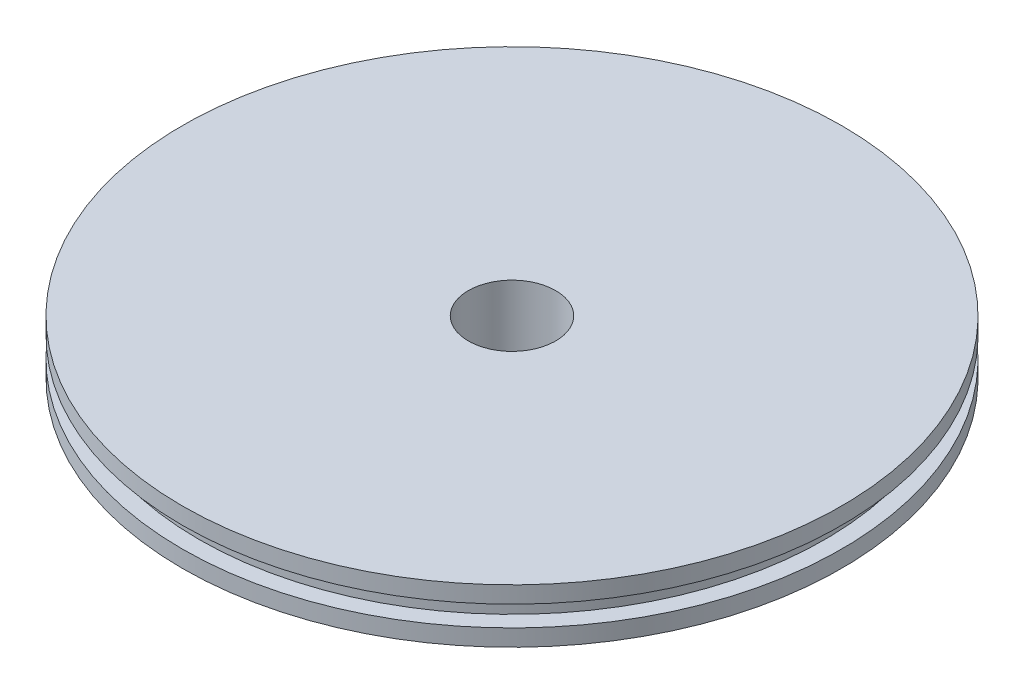
ISO-10303-21;
HEADER;
FILE_DESCRIPTION(('STEP AP214'),'2;1');
FILE_NAME('part.step','',(''),(''),'','','');
FILE_SCHEMA(('AUTOMOTIVE_DESIGN { 1 0 10303 214 1 1 1 1 }'));
ENDSEC;
DATA;
#1=APPLICATION_CONTEXT('core data for automotive mechanical design processes');
#2=APPLICATION_PROTOCOL_DEFINITION('international standard','automotive_design',2000,#1);
#3=PRODUCT_CONTEXT('',#1,'mechanical');
#4=PRODUCT('Part','Part','',(#3));
#5=PRODUCT_RELATED_PRODUCT_CATEGORY('part','',(#4));
#6=PRODUCT_DEFINITION_FORMATION('','',#4);
#7=PRODUCT_DEFINITION_CONTEXT('part definition',#1,'design');
#8=PRODUCT_DEFINITION('design','',#6,#7);
#9=PRODUCT_DEFINITION_SHAPE('','',#8);
#10=(LENGTH_UNIT() NAMED_UNIT(*) SI_UNIT(.MILLI.,.METRE.));
#11=(NAMED_UNIT(*) PLANE_ANGLE_UNIT() SI_UNIT($,.RADIAN.));
#12=(NAMED_UNIT(*) SI_UNIT($,.STERADIAN.) SOLID_ANGLE_UNIT());
#13=UNCERTAINTY_MEASURE_WITH_UNIT(LENGTH_MEASURE(1.E-05),#10,'distance_accuracy_value','');
#14=(GEOMETRIC_REPRESENTATION_CONTEXT(3) GLOBAL_UNCERTAINTY_ASSIGNED_CONTEXT((#13)) GLOBAL_UNIT_ASSIGNED_CONTEXT((#10,
#11,#12)) REPRESENTATION_CONTEXT('',''));
#15=CARTESIAN_POINT('',(0.,0.,0.));
#16=DIRECTION('',(0.,0.,1.));
#17=DIRECTION('',(1.,0.,0.));
#18=AXIS2_PLACEMENT_3D('',#15,#16,#17);
#19=CARTESIAN_POINT('',(0.,0.,30.9499));
#20=DIRECTION('',(0.,1.,0.));
#21=DIRECTION('',(0.,0.,1.));
#22=AXIS2_PLACEMENT_3D('',#19,#20,#21);
#23=PLANE('',#22);
#24=CARTESIAN_POINT('',(0.,0.,0.));
#25=DIRECTION('',(0.,-1.,0.));
#26=DIRECTION('',(0.,0.,-1.));
#27=AXIS2_PLACEMENT_3D('',#24,#25,#26);
#28=CIRCLE('',#27,4.1021);
#29=CARTESIAN_POINT('',(0.,0.,-4.1021));
#30=VERTEX_POINT('',#29);
#31=EDGE_CURVE('E57',#30,#30,#28,.T.);
#32=ORIENTED_EDGE('',*,*,#31,.T.);
#33=EDGE_LOOP('',(#32));
#34=FACE_BOUND('',#33,.T.);
#35=CARTESIAN_POINT('',(0.,0.,0.));
#36=DIRECTION('',(0.,1.,0.));
#37=DIRECTION('',(0.,0.,1.));
#38=AXIS2_PLACEMENT_3D('',#35,#36,#37);
#39=CIRCLE('',#38,30.9499);
#40=CARTESIAN_POINT('',(0.,0.,30.9499));
#41=VERTEX_POINT('',#40);
#42=EDGE_CURVE('E60',#41,#41,#39,.T.);
#43=ORIENTED_EDGE('',*,*,#42,.T.);
#44=EDGE_LOOP('',(#43));
#45=FACE_BOUND('',#44,.T.);
#46=ADVANCED_FACE('F41',(#34,#45),#23,.T.);
#47=CARTESIAN_POINT('',(0.,-5.08,0.));
#48=DIRECTION('',(0.,-1.,0.));
#49=DIRECTION('',(0.,0.,-1.));
#50=AXIS2_PLACEMENT_3D('',#47,#48,#49);
#51=PLANE('',#50);
#52=CARTESIAN_POINT('',(0.,-5.08,0.));
#53=DIRECTION('',(0.,-1.,0.));
#54=DIRECTION('',(0.,0.,-1.));
#55=AXIS2_PLACEMENT_3D('',#52,#53,#54);
#56=CIRCLE('',#55,22.86);
#57=CARTESIAN_POINT('',(0.,-5.08,-22.86));
#58=VERTEX_POINT('',#57);
#59=EDGE_CURVE('E10',#58,#58,#56,.T.);
#60=ORIENTED_EDGE('',*,*,#59,.F.);
#61=EDGE_LOOP('',(#60));
#62=FACE_BOUND('',#61,.T.);
#63=CARTESIAN_POINT('',(0.,-5.08,0.));
#64=DIRECTION('',(0.,1.,0.));
#65=DIRECTION('',(0.,0.,1.));
#66=AXIS2_PLACEMENT_3D('',#63,#64,#65);
#67=CIRCLE('',#66,30.9499);
#68=CARTESIAN_POINT('',(0.,-5.08,30.9499));
#69=VERTEX_POINT('',#68);
#70=EDGE_CURVE('E44',#69,#69,#67,.T.);
#71=ORIENTED_EDGE('',*,*,#70,.F.);
#72=EDGE_LOOP('',(#71));
#73=FACE_BOUND('',#72,.T.);
#74=ADVANCED_FACE('F79',(#62,#73),#51,.T.);
#75=CARTESIAN_POINT('',(0.,0.,0.));
#76=DIRECTION('',(0.,1.,0.));
#77=DIRECTION('',(0.,0.,1.));
#78=AXIS2_PLACEMENT_3D('',#75,#76,#77);
#79=CYLINDRICAL_SURFACE('',#78,30.9499);
#80=ORIENTED_EDGE('',*,*,#70,.T.);
#81=EDGE_LOOP('',(#80));
#82=FACE_BOUND('',#81,.T.);
#83=CARTESIAN_POINT('',(0.,-3.5052,0.));
#84=DIRECTION('',(0.,1.,0.));
#85=DIRECTION('',(0.,0.,1.));
#86=AXIS2_PLACEMENT_3D('',#83,#84,#85);
#87=CIRCLE('',#86,30.9499);
#88=CARTESIAN_POINT('',(0.,-3.5052,30.9499));
#89=VERTEX_POINT('',#88);
#90=EDGE_CURVE('E52',#89,#89,#87,.T.);
#91=ORIENTED_EDGE('',*,*,#90,.F.);
#92=EDGE_LOOP('',(#91));
#93=FACE_BOUND('',#92,.T.);
#94=ADVANCED_FACE('F77',(#82,#93),#79,.T.);
#95=CARTESIAN_POINT('',(0.,-3.5052,30.9499));
#96=DIRECTION('',(0.,1.,0.));
#97=DIRECTION('',(0.,0.,1.));
#98=AXIS2_PLACEMENT_3D('',#95,#96,#97);
#99=PLANE('',#98);
#100=ORIENTED_EDGE('',*,*,#90,.T.);
#101=EDGE_LOOP('',(#100));
#102=FACE_BOUND('',#101,.T.);
#103=CARTESIAN_POINT('',(0.,-3.5052,0.));
#104=DIRECTION('',(0.,1.,0.));
#105=DIRECTION('',(0.,0.,1.));
#106=AXIS2_PLACEMENT_3D('',#103,#104,#105);
#107=CIRCLE('',#106,29.3878);
#108=CARTESIAN_POINT('',(0.,-3.5052,29.3878));
#109=VERTEX_POINT('',#108);
#110=EDGE_CURVE('E69',#109,#109,#107,.T.);
#111=ORIENTED_EDGE('',*,*,#110,.F.);
#112=EDGE_LOOP('',(#111));
#113=FACE_BOUND('',#112,.T.);
#114=ADVANCED_FACE('F74',(#102,#113),#99,.T.);
#115=CARTESIAN_POINT('',(0.,0.,0.));
#116=DIRECTION('',(0.,1.,0.));
#117=DIRECTION('',(0.,0.,1.));
#118=AXIS2_PLACEMENT_3D('',#115,#116,#117);
#119=CYLINDRICAL_SURFACE('',#118,29.3878);
#120=ORIENTED_EDGE('',*,*,#110,.T.);
#121=EDGE_LOOP('',(#120));
#122=FACE_BOUND('',#121,.T.);
#123=CARTESIAN_POINT('',(0.,-1.5748,0.));
#124=DIRECTION('',(0.,1.,0.));
#125=DIRECTION('',(0.,0.,1.));
#126=AXIS2_PLACEMENT_3D('',#123,#124,#125);
#127=CIRCLE('',#126,29.3878);
#128=CARTESIAN_POINT('',(0.,-1.5748,29.3878));
#129=VERTEX_POINT('',#128);
#130=EDGE_CURVE('E66',#129,#129,#127,.T.);
#131=ORIENTED_EDGE('',*,*,#130,.F.);
#132=EDGE_LOOP('',(#131));
#133=FACE_BOUND('',#132,.T.);
#134=ADVANCED_FACE('F85',(#122,#133),#119,.T.);
#135=CARTESIAN_POINT('',(0.,-1.5748,29.3878));
#136=DIRECTION('',(0.,-1.,0.));
#137=DIRECTION('',(0.,0.,-1.));
#138=AXIS2_PLACEMENT_3D('',#135,#136,#137);
#139=PLANE('',#138);
#140=ORIENTED_EDGE('',*,*,#130,.T.);
#141=EDGE_LOOP('',(#140));
#142=FACE_BOUND('',#141,.T.);
#143=CARTESIAN_POINT('',(0.,-1.5748,0.));
#144=DIRECTION('',(0.,1.,0.));
#145=DIRECTION('',(0.,0.,1.));
#146=AXIS2_PLACEMENT_3D('',#143,#144,#145);
#147=CIRCLE('',#146,30.9499);
#148=CARTESIAN_POINT('',(0.,-1.5748,30.9499));
#149=VERTEX_POINT('',#148);
#150=EDGE_CURVE('E63',#149,#149,#147,.T.);
#151=ORIENTED_EDGE('',*,*,#150,.F.);
#152=EDGE_LOOP('',(#151));
#153=FACE_BOUND('',#152,.T.);
#154=ADVANCED_FACE('F100',(#142,#153),#139,.T.);
#155=CARTESIAN_POINT('',(0.,0.,0.));
#156=DIRECTION('',(0.,1.,0.));
#157=DIRECTION('',(0.,0.,1.));
#158=AXIS2_PLACEMENT_3D('',#155,#156,#157);
#159=CYLINDRICAL_SURFACE('',#158,30.9499);
#160=ORIENTED_EDGE('',*,*,#150,.T.);
#161=EDGE_LOOP('',(#160));
#162=FACE_BOUND('',#161,.T.);
#163=ORIENTED_EDGE('',*,*,#42,.F.);
#164=EDGE_LOOP('',(#163));
#165=FACE_BOUND('',#164,.T.);
#166=ADVANCED_FACE('F98',(#162,#165),#159,.T.);
#167=CARTESIAN_POINT('',(0.,0.,0.));
#168=DIRECTION('',(0.,-1.,0.));
#169=DIRECTION('',(0.,0.,-1.));
#170=AXIS2_PLACEMENT_3D('',#167,#168,#169);
#171=CYLINDRICAL_SURFACE('',#170,4.1021);
#172=ORIENTED_EDGE('',*,*,#31,.F.);
#173=EDGE_LOOP('',(#172));
#174=FACE_BOUND('',#173,.T.);
#175=CARTESIAN_POINT('',(0.,-6.096,0.));
#176=DIRECTION('',(0.,-1.,0.));
#177=DIRECTION('',(0.,0.,-1.));
#178=AXIS2_PLACEMENT_3D('',#175,#176,#177);
#179=CIRCLE('',#178,4.1021);
#180=CARTESIAN_POINT('',(0.,-6.096,-4.1021));
#181=VERTEX_POINT('',#180);
#182=EDGE_CURVE('E167',#181,#181,#179,.T.);
#183=ORIENTED_EDGE('',*,*,#182,.T.);
#184=EDGE_LOOP('',(#183));
#185=FACE_BOUND('',#184,.T.);
#186=ADVANCED_FACE('F99',(#174,#185),#171,.F.);
#187=CARTESIAN_POINT('',(0.,-6.096,0.));
#188=DIRECTION('',(0.,-1.,0.));
#189=DIRECTION('',(0.,0.,-1.));
#190=AXIS2_PLACEMENT_3D('',#187,#188,#189);
#191=PLANE('',#190);
#192=CARTESIAN_POINT('',(0.,-6.096,0.));
#193=DIRECTION('',(0.,-1.,0.));
#194=DIRECTION('',(0.,0.,-1.));
#195=AXIS2_PLACEMENT_3D('',#192,#193,#194);
#196=CIRCLE('',#195,22.86);
#197=CARTESIAN_POINT('',(0.,-6.096,-22.86));
#198=VERTEX_POINT('',#197);
#199=EDGE_CURVE('E55',#198,#198,#196,.T.);
#200=ORIENTED_EDGE('',*,*,#199,.T.);
#201=EDGE_LOOP('',(#200));
#202=FACE_BOUND('',#201,.T.);
#203=ORIENTED_EDGE('',*,*,#182,.F.);
#204=EDGE_LOOP('',(#203));
#205=FACE_BOUND('',#204,.T.);
#206=ADVANCED_FACE('F107',(#202,#205),#191,.T.);
#207=CARTESIAN_POINT('',(0.,-6.096,0.));
#208=DIRECTION('',(0.,1.,0.));
#209=DIRECTION('',(0.,0.,1.));
#210=AXIS2_PLACEMENT_3D('',#207,#208,#209);
#211=CYLINDRICAL_SURFACE('',#210,22.86);
#212=ORIENTED_EDGE('',*,*,#199,.F.);
#213=EDGE_LOOP('',(#212));
#214=FACE_BOUND('',#213,.T.);
#215=ORIENTED_EDGE('',*,*,#59,.T.);
#216=EDGE_LOOP('',(#215));
#217=FACE_BOUND('',#216,.T.);
#218=ADVANCED_FACE('F153',(#214,#217),#211,.T.);
#219=CLOSED_SHELL('',(#46,#74,#94,#114,#134,#154,#166,#186,#206,#218));
#220=MANIFOLD_SOLID_BREP('B2',#219);
#221=ADVANCED_BREP_SHAPE_REPRESENTATION('',(#18,#220),#14);
#222=SHAPE_DEFINITION_REPRESENTATION(#9,#221);
ENDSEC;
END-ISO-10303-21;
